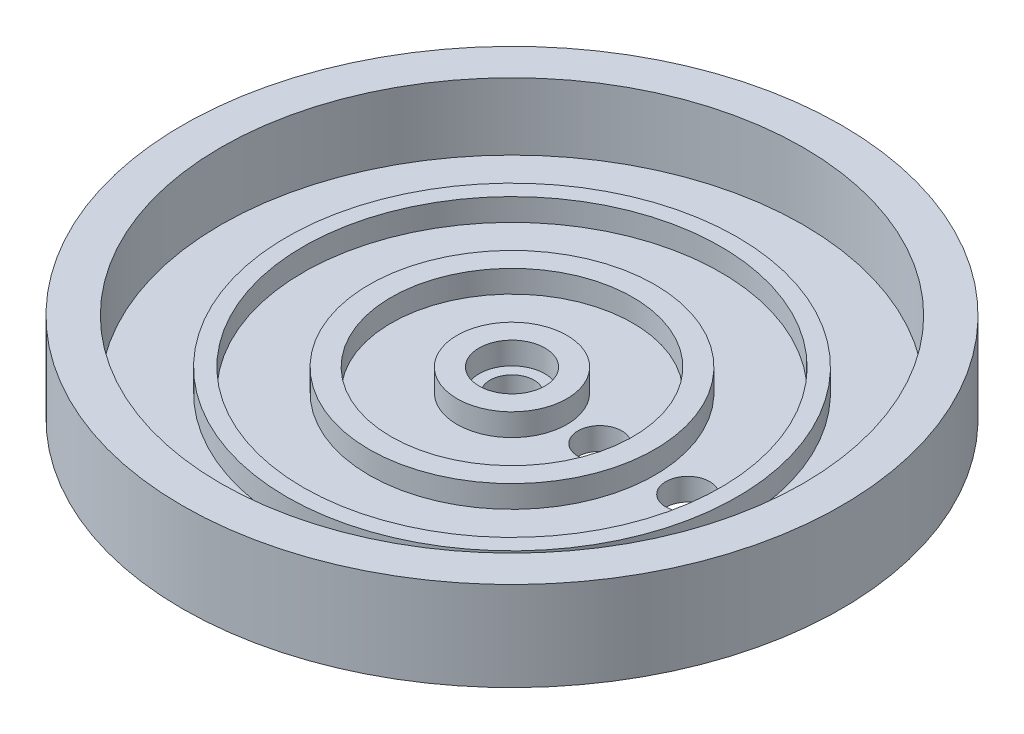
ISO-10303-21;
HEADER;
FILE_DESCRIPTION(('STEP AP214'),'2;1');
FILE_NAME('part.step','',(''),(''),'','','');
FILE_SCHEMA(('AUTOMOTIVE_DESIGN { 1 0 10303 214 1 1 1 1 }'));
ENDSEC;
DATA;
#1=APPLICATION_CONTEXT('core data for automotive mechanical design processes');
#2=APPLICATION_PROTOCOL_DEFINITION('international standard','automotive_design',2000,#1);
#3=PRODUCT_CONTEXT('',#1,'mechanical');
#4=PRODUCT('Part','Part','',(#3));
#5=PRODUCT_RELATED_PRODUCT_CATEGORY('part','',(#4));
#6=PRODUCT_DEFINITION_FORMATION('','',#4);
#7=PRODUCT_DEFINITION_CONTEXT('part definition',#1,'design');
#8=PRODUCT_DEFINITION('design','',#6,#7);
#9=PRODUCT_DEFINITION_SHAPE('','',#8);
#10=(LENGTH_UNIT() NAMED_UNIT(*) SI_UNIT(.MILLI.,.METRE.));
#11=(NAMED_UNIT(*) PLANE_ANGLE_UNIT() SI_UNIT($,.RADIAN.));
#12=(NAMED_UNIT(*) SI_UNIT($,.STERADIAN.) SOLID_ANGLE_UNIT());
#13=UNCERTAINTY_MEASURE_WITH_UNIT(LENGTH_MEASURE(1.E-05),#10,'distance_accuracy_value','');
#14=(GEOMETRIC_REPRESENTATION_CONTEXT(3) GLOBAL_UNCERTAINTY_ASSIGNED_CONTEXT((#13)) GLOBAL_UNIT_ASSIGNED_CONTEXT((#10,
#11,#12)) REPRESENTATION_CONTEXT('',''));
#15=CARTESIAN_POINT('',(0.,0.,0.));
#16=DIRECTION('',(0.,0.,1.));
#17=DIRECTION('',(1.,0.,0.));
#18=AXIS2_PLACEMENT_3D('',#15,#16,#17);
#19=CARTESIAN_POINT('',(0.,1.016,0.));
#20=DIRECTION('',(0.,1.,0.));
#21=DIRECTION('',(0.,0.,1.));
#22=AXIS2_PLACEMENT_3D('',#19,#20,#21);
#23=PLANE('',#22);
#24=CARTESIAN_POINT('',(0.,1.016,0.));
#25=DIRECTION('',(0.,1.,0.));
#26=DIRECTION('',(0.,0.,1.));
#27=AXIS2_PLACEMENT_3D('',#24,#25,#26);
#28=CIRCLE('',#27,1.);
#29=CARTESIAN_POINT('',(0.,1.016,1.));
#30=VERTEX_POINT('',#29);
#31=EDGE_CURVE('E93',#30,#30,#28,.T.);
#32=ORIENTED_EDGE('',*,*,#31,.F.);
#33=EDGE_LOOP('',(#32));
#34=FACE_BOUND('',#33,.T.);
#35=CARTESIAN_POINT('',(0.,1.016,0.));
#36=DIRECTION('',(0.,1.,0.));
#37=DIRECTION('',(0.,0.,1.));
#38=AXIS2_PLACEMENT_3D('',#35,#36,#37);
#39=CIRCLE('',#38,1.5);
#40=CARTESIAN_POINT('',(0.,1.016,1.5));
#41=VERTEX_POINT('',#40);
#42=EDGE_CURVE('E11',#41,#41,#39,.F.);
#43=ORIENTED_EDGE('',*,*,#42,.F.);
#44=EDGE_LOOP('',(#43));
#45=FACE_BOUND('',#44,.T.);
#46=ADVANCED_FACE('F70',(#34,#45),#23,.T.);
#47=CARTESIAN_POINT('',(0.,1.016,0.));
#48=DIRECTION('',(0.,1.,0.));
#49=DIRECTION('',(0.,0.,1.));
#50=AXIS2_PLACEMENT_3D('',#47,#48,#49);
#51=CIRCLE('',#50,2.5);
#52=CARTESIAN_POINT('',(0.,1.016,2.5));
#53=VERTEX_POINT('',#52);
#54=EDGE_CURVE('E130',#53,#53,#51,.T.);
#55=ORIENTED_EDGE('',*,*,#54,.F.);
#56=EDGE_LOOP('',(#55));
#57=FACE_BOUND('',#56,.T.);
#58=CARTESIAN_POINT('',(4.,1.016,0.));
#59=DIRECTION('',(0.,1.,0.));
#60=DIRECTION('',(0.,0.,1.));
#61=AXIS2_PLACEMENT_3D('',#58,#59,#60);
#62=CIRCLE('',#61,1.);
#63=CARTESIAN_POINT('',(4.,1.016,1.));
#64=VERTEX_POINT('',#63);
#65=EDGE_CURVE('E97',#64,#64,#62,.T.);
#66=ORIENTED_EDGE('',*,*,#65,.F.);
#67=EDGE_LOOP('',(#66));
#68=FACE_BOUND('',#67,.T.);
#69=CARTESIAN_POINT('',(0.,1.016,0.));
#70=DIRECTION('',(0.,1.,0.));
#71=DIRECTION('',(0.,0.,1.));
#72=AXIS2_PLACEMENT_3D('',#69,#70,#71);
#73=CIRCLE('',#72,5.5);
#74=CARTESIAN_POINT('',(0.,1.016,5.5));
#75=VERTEX_POINT('',#74);
#76=EDGE_CURVE('E77',#75,#75,#73,.F.);
#77=ORIENTED_EDGE('',*,*,#76,.F.);
#78=EDGE_LOOP('',(#77));
#79=FACE_BOUND('',#78,.T.);
#80=ADVANCED_FACE('F159',(#57,#68,#79),#23,.T.);
#81=CARTESIAN_POINT('',(0.,1.016,0.));
#82=DIRECTION('',(0.,1.,0.));
#83=DIRECTION('',(0.,0.,1.));
#84=AXIS2_PLACEMENT_3D('',#81,#82,#83);
#85=CIRCLE('',#84,6.5);
#86=CARTESIAN_POINT('',(0.,1.016,6.5));
#87=VERTEX_POINT('',#86);
#88=EDGE_CURVE('E121',#87,#87,#85,.T.);
#89=ORIENTED_EDGE('',*,*,#88,.F.);
#90=EDGE_LOOP('',(#89));
#91=FACE_BOUND('',#90,.T.);
#92=CARTESIAN_POINT('',(8.,1.016,0.));
#93=DIRECTION('',(0.,1.,0.));
#94=DIRECTION('',(0.,0.,1.));
#95=AXIS2_PLACEMENT_3D('',#92,#93,#94);
#96=CIRCLE('',#95,1.);
#97=CARTESIAN_POINT('',(8.,1.016,1.));
#98=VERTEX_POINT('',#97);
#99=EDGE_CURVE('E103',#98,#98,#96,.T.);
#100=ORIENTED_EDGE('',*,*,#99,.F.);
#101=EDGE_LOOP('',(#100));
#102=FACE_BOUND('',#101,.T.);
#103=CARTESIAN_POINT('',(0.,1.016,0.));
#104=DIRECTION('',(0.,1.,0.));
#105=DIRECTION('',(0.,0.,1.));
#106=AXIS2_PLACEMENT_3D('',#103,#104,#105);
#107=CIRCLE('',#106,9.5);
#108=CARTESIAN_POINT('',(0.,1.016,9.5));
#109=VERTEX_POINT('',#108);
#110=EDGE_CURVE('E81',#109,#109,#107,.F.);
#111=ORIENTED_EDGE('',*,*,#110,.F.);
#112=EDGE_LOOP('',(#111));
#113=FACE_BOUND('',#112,.T.);
#114=ADVANCED_FACE('F166',(#91,#102,#113),#23,.T.);
#115=CARTESIAN_POINT('',(0.,1.016,0.));
#116=DIRECTION('',(0.,1.,0.));
#117=DIRECTION('',(0.,0.,1.));
#118=AXIS2_PLACEMENT_3D('',#115,#116,#117);
#119=CIRCLE('',#118,10.25);
#120=CARTESIAN_POINT('',(0.,1.016,10.25));
#121=VERTEX_POINT('',#120);
#122=EDGE_CURVE('E112',#121,#121,#119,.T.);
#123=ORIENTED_EDGE('',*,*,#122,.F.);
#124=EDGE_LOOP('',(#123));
#125=FACE_BOUND('',#124,.T.);
#126=CARTESIAN_POINT('',(0.,1.016,0.));
#127=DIRECTION('',(0.,1.,0.));
#128=DIRECTION('',(0.,0.,1.));
#129=AXIS2_PLACEMENT_3D('',#126,#127,#128);
#130=CIRCLE('',#129,13.25);
#131=CARTESIAN_POINT('',(0.,1.016,13.25));
#132=VERTEX_POINT('',#131);
#133=EDGE_CURVE('E85',#132,#132,#130,.F.);
#134=ORIENTED_EDGE('',*,*,#133,.F.);
#135=EDGE_LOOP('',(#134));
#136=FACE_BOUND('',#135,.T.);
#137=ADVANCED_FACE('F162',(#125,#136),#23,.T.);
#138=CARTESIAN_POINT('',(0.,0.,0.));
#139=DIRECTION('',(0.,1.,0.));
#140=DIRECTION('',(0.,0.,1.));
#141=AXIS2_PLACEMENT_3D('',#138,#139,#140);
#142=PLANE('',#141);
#143=CARTESIAN_POINT('',(0.,0.,0.));
#144=DIRECTION('',(0.,1.,0.));
#145=DIRECTION('',(0.,0.,1.));
#146=AXIS2_PLACEMENT_3D('',#143,#144,#145);
#147=CIRCLE('',#146,15.);
#148=CARTESIAN_POINT('',(0.,0.,15.));
#149=VERTEX_POINT('',#148);
#150=EDGE_CURVE('E90',#149,#149,#147,.T.);
#151=ORIENTED_EDGE('',*,*,#150,.F.);
#152=EDGE_LOOP('',(#151));
#153=FACE_BOUND('',#152,.T.);
#154=CARTESIAN_POINT('',(0.,0.,0.));
#155=DIRECTION('',(0.,1.,0.));
#156=DIRECTION('',(0.,0.,1.));
#157=AXIS2_PLACEMENT_3D('',#154,#155,#156);
#158=CIRCLE('',#157,1.);
#159=CARTESIAN_POINT('',(0.,0.,1.));
#160=VERTEX_POINT('',#159);
#161=EDGE_CURVE('E94',#160,#160,#158,.T.);
#162=ORIENTED_EDGE('',*,*,#161,.T.);
#163=EDGE_LOOP('',(#162));
#164=FACE_BOUND('',#163,.T.);
#165=CARTESIAN_POINT('',(4.,0.,0.));
#166=DIRECTION('',(0.,1.,0.));
#167=DIRECTION('',(0.,0.,1.));
#168=AXIS2_PLACEMENT_3D('',#165,#166,#167);
#169=CIRCLE('',#168,1.);
#170=CARTESIAN_POINT('',(4.,0.,1.));
#171=VERTEX_POINT('',#170);
#172=EDGE_CURVE('E100',#171,#171,#169,.T.);
#173=ORIENTED_EDGE('',*,*,#172,.T.);
#174=EDGE_LOOP('',(#173));
#175=FACE_BOUND('',#174,.T.);
#176=CARTESIAN_POINT('',(8.,0.,0.));
#177=DIRECTION('',(0.,1.,0.));
#178=DIRECTION('',(0.,0.,1.));
#179=AXIS2_PLACEMENT_3D('',#176,#177,#178);
#180=CIRCLE('',#179,1.);
#181=CARTESIAN_POINT('',(8.,0.,1.));
#182=VERTEX_POINT('',#181);
#183=EDGE_CURVE('E106',#182,#182,#180,.T.);
#184=ORIENTED_EDGE('',*,*,#183,.T.);
#185=EDGE_LOOP('',(#184));
#186=FACE_BOUND('',#185,.T.);
#187=ADVANCED_FACE('F172',(#153,#164,#175,#186),#142,.F.);
#188=CARTESIAN_POINT('',(0.,1.016,0.));
#189=DIRECTION('',(0.,-1.,0.));
#190=DIRECTION('',(0.,0.,-1.));
#191=AXIS2_PLACEMENT_3D('',#188,#189,#190);
#192=CYLINDRICAL_SURFACE('',#191,15.);
#193=ORIENTED_EDGE('',*,*,#150,.T.);
#194=EDGE_LOOP('',(#193));
#195=FACE_BOUND('',#194,.T.);
#196=CARTESIAN_POINT('',(0.,4.064,0.));
#197=DIRECTION('',(0.,1.,0.));
#198=DIRECTION('',(0.,0.,1.));
#199=AXIS2_PLACEMENT_3D('',#196,#197,#198);
#200=CIRCLE('',#199,15.);
#201=CARTESIAN_POINT('',(0.,4.064,15.));
#202=VERTEX_POINT('',#201);
#203=EDGE_CURVE('E134',#202,#202,#200,.T.);
#204=ORIENTED_EDGE('',*,*,#203,.F.);
#205=EDGE_LOOP('',(#204));
#206=FACE_BOUND('',#205,.T.);
#207=ADVANCED_FACE('F72',(#195,#206),#192,.T.);
#208=CARTESIAN_POINT('',(0.,1.016,0.));
#209=DIRECTION('',(0.,-1.,0.));
#210=DIRECTION('',(0.,0.,-1.));
#211=AXIS2_PLACEMENT_3D('',#208,#209,#210);
#212=CYLINDRICAL_SURFACE('',#211,1.);
#213=ORIENTED_EDGE('',*,*,#31,.T.);
#214=EDGE_LOOP('',(#213));
#215=FACE_BOUND('',#214,.T.);
#216=ORIENTED_EDGE('',*,*,#161,.F.);
#217=EDGE_LOOP('',(#216));
#218=FACE_BOUND('',#217,.T.);
#219=ADVANCED_FACE('F201',(#215,#218),#212,.F.);
#220=CARTESIAN_POINT('',(4.,1.016,0.));
#221=DIRECTION('',(0.,-1.,0.));
#222=DIRECTION('',(0.,0.,-1.));
#223=AXIS2_PLACEMENT_3D('',#220,#221,#222);
#224=CYLINDRICAL_SURFACE('',#223,1.);
#225=ORIENTED_EDGE('',*,*,#65,.T.);
#226=EDGE_LOOP('',(#225));
#227=FACE_BOUND('',#226,.T.);
#228=ORIENTED_EDGE('',*,*,#172,.F.);
#229=EDGE_LOOP('',(#228));
#230=FACE_BOUND('',#229,.T.);
#231=ADVANCED_FACE('F195',(#227,#230),#224,.F.);
#232=CARTESIAN_POINT('',(8.,1.016,0.));
#233=DIRECTION('',(0.,-1.,0.));
#234=DIRECTION('',(0.,0.,-1.));
#235=AXIS2_PLACEMENT_3D('',#232,#233,#234);
#236=CYLINDRICAL_SURFACE('',#235,1.);
#237=ORIENTED_EDGE('',*,*,#99,.T.);
#238=EDGE_LOOP('',(#237));
#239=FACE_BOUND('',#238,.T.);
#240=ORIENTED_EDGE('',*,*,#183,.F.);
#241=EDGE_LOOP('',(#240));
#242=FACE_BOUND('',#241,.T.);
#243=ADVANCED_FACE('F186',(#239,#242),#236,.F.);
#244=CARTESIAN_POINT('',(0.,2.032,0.));
#245=DIRECTION('',(0.,-1.,0.));
#246=DIRECTION('',(0.,0.,-1.));
#247=AXIS2_PLACEMENT_3D('',#244,#245,#246);
#248=CYLINDRICAL_SURFACE('',#247,13.25);
#249=ORIENTED_EDGE('',*,*,#133,.T.);
#250=EDGE_LOOP('',(#249));
#251=FACE_BOUND('',#250,.T.);
#252=CARTESIAN_POINT('',(0.,4.064,0.));
#253=DIRECTION('',(0.,1.,0.));
#254=DIRECTION('',(0.,0.,1.));
#255=AXIS2_PLACEMENT_3D('',#252,#253,#254);
#256=CIRCLE('',#255,13.25);
#257=CARTESIAN_POINT('',(0.,4.064,13.25));
#258=VERTEX_POINT('',#257);
#259=EDGE_CURVE('E141',#258,#258,#256,.T.);
#260=ORIENTED_EDGE('',*,*,#259,.T.);
#261=EDGE_LOOP('',(#260));
#262=FACE_BOUND('',#261,.T.);
#263=ADVANCED_FACE('F145',(#251,#262),#248,.F.);
#264=CARTESIAN_POINT('',(0.,2.032,0.));
#265=DIRECTION('',(0.,-1.,0.));
#266=DIRECTION('',(0.,0.,-1.));
#267=AXIS2_PLACEMENT_3D('',#264,#265,#266);
#268=CYLINDRICAL_SURFACE('',#267,9.5);
#269=CARTESIAN_POINT('',(0.,2.032,0.));
#270=DIRECTION('',(0.,1.,0.));
#271=DIRECTION('',(0.,0.,1.));
#272=AXIS2_PLACEMENT_3D('',#269,#270,#271);
#273=CIRCLE('',#272,9.5);
#274=CARTESIAN_POINT('',(0.,2.032,9.5));
#275=VERTEX_POINT('',#274);
#276=EDGE_CURVE('E115',#275,#275,#273,.T.);
#277=ORIENTED_EDGE('',*,*,#276,.T.);
#278=EDGE_LOOP('',(#277));
#279=FACE_BOUND('',#278,.T.);
#280=ORIENTED_EDGE('',*,*,#110,.T.);
#281=EDGE_LOOP('',(#280));
#282=FACE_BOUND('',#281,.T.);
#283=ADVANCED_FACE('F185',(#279,#282),#268,.F.);
#284=CARTESIAN_POINT('',(0.,2.032,0.));
#285=DIRECTION('',(0.,-1.,0.));
#286=DIRECTION('',(0.,0.,-1.));
#287=AXIS2_PLACEMENT_3D('',#284,#285,#286);
#288=CYLINDRICAL_SURFACE('',#287,10.25);
#289=CARTESIAN_POINT('',(0.,2.032,0.));
#290=DIRECTION('',(0.,1.,0.));
#291=DIRECTION('',(0.,0.,1.));
#292=AXIS2_PLACEMENT_3D('',#289,#290,#291);
#293=CIRCLE('',#292,10.25);
#294=CARTESIAN_POINT('',(0.,2.032,10.25));
#295=VERTEX_POINT('',#294);
#296=EDGE_CURVE('E109',#295,#295,#293,.T.);
#297=ORIENTED_EDGE('',*,*,#296,.F.);
#298=EDGE_LOOP('',(#297));
#299=FACE_BOUND('',#298,.T.);
#300=ORIENTED_EDGE('',*,*,#122,.T.);
#301=EDGE_LOOP('',(#300));
#302=FACE_BOUND('',#301,.T.);
#303=ADVANCED_FACE('F192',(#299,#302),#288,.T.);
#304=CARTESIAN_POINT('',(0.,2.032,0.));
#305=DIRECTION('',(0.,1.,0.));
#306=DIRECTION('',(0.,0.,1.));
#307=AXIS2_PLACEMENT_3D('',#304,#305,#306);
#308=PLANE('',#307);
#309=ORIENTED_EDGE('',*,*,#276,.F.);
#310=EDGE_LOOP('',(#309));
#311=FACE_BOUND('',#310,.T.);
#312=ORIENTED_EDGE('',*,*,#296,.T.);
#313=EDGE_LOOP('',(#312));
#314=FACE_BOUND('',#313,.T.);
#315=ADVANCED_FACE('F282',(#311,#314),#308,.T.);
#316=CARTESIAN_POINT('',(0.,2.032,0.));
#317=DIRECTION('',(0.,-1.,0.));
#318=DIRECTION('',(0.,0.,-1.));
#319=AXIS2_PLACEMENT_3D('',#316,#317,#318);
#320=CYLINDRICAL_SURFACE('',#319,5.5);
#321=CARTESIAN_POINT('',(0.,2.032,0.));
#322=DIRECTION('',(0.,1.,0.));
#323=DIRECTION('',(0.,0.,1.));
#324=AXIS2_PLACEMENT_3D('',#321,#322,#323);
#325=CIRCLE('',#324,5.5);
#326=CARTESIAN_POINT('',(0.,2.032,5.5));
#327=VERTEX_POINT('',#326);
#328=EDGE_CURVE('E124',#327,#327,#325,.T.);
#329=ORIENTED_EDGE('',*,*,#328,.T.);
#330=EDGE_LOOP('',(#329));
#331=FACE_BOUND('',#330,.T.);
#332=ORIENTED_EDGE('',*,*,#76,.T.);
#333=EDGE_LOOP('',(#332));
#334=FACE_BOUND('',#333,.T.);
#335=ADVANCED_FACE('F291',(#331,#334),#320,.F.);
#336=CARTESIAN_POINT('',(0.,2.032,0.));
#337=DIRECTION('',(0.,-1.,0.));
#338=DIRECTION('',(0.,0.,-1.));
#339=AXIS2_PLACEMENT_3D('',#336,#337,#338);
#340=CYLINDRICAL_SURFACE('',#339,6.5);
#341=CARTESIAN_POINT('',(0.,2.032,0.));
#342=DIRECTION('',(0.,1.,0.));
#343=DIRECTION('',(0.,0.,1.));
#344=AXIS2_PLACEMENT_3D('',#341,#342,#343);
#345=CIRCLE('',#344,6.5);
#346=CARTESIAN_POINT('',(0.,2.032,6.5));
#347=VERTEX_POINT('',#346);
#348=EDGE_CURVE('E116',#347,#347,#345,.T.);
#349=ORIENTED_EDGE('',*,*,#348,.F.);
#350=EDGE_LOOP('',(#349));
#351=FACE_BOUND('',#350,.T.);
#352=ORIENTED_EDGE('',*,*,#88,.T.);
#353=EDGE_LOOP('',(#352));
#354=FACE_BOUND('',#353,.T.);
#355=ADVANCED_FACE('F301',(#351,#354),#340,.T.);
#356=CARTESIAN_POINT('',(0.,2.032,0.));
#357=DIRECTION('',(0.,1.,0.));
#358=DIRECTION('',(0.,0.,1.));
#359=AXIS2_PLACEMENT_3D('',#356,#357,#358);
#360=PLANE('',#359);
#361=ORIENTED_EDGE('',*,*,#328,.F.);
#362=EDGE_LOOP('',(#361));
#363=FACE_BOUND('',#362,.T.);
#364=ORIENTED_EDGE('',*,*,#348,.T.);
#365=EDGE_LOOP('',(#364));
#366=FACE_BOUND('',#365,.T.);
#367=ADVANCED_FACE('F311',(#363,#366),#360,.T.);
#368=CARTESIAN_POINT('',(0.,2.032,0.));
#369=DIRECTION('',(0.,-1.,0.));
#370=DIRECTION('',(0.,0.,-1.));
#371=AXIS2_PLACEMENT_3D('',#368,#369,#370);
#372=CYLINDRICAL_SURFACE('',#371,1.5);
#373=CARTESIAN_POINT('',(0.,2.032,0.));
#374=DIRECTION('',(0.,1.,0.));
#375=DIRECTION('',(0.,0.,1.));
#376=AXIS2_PLACEMENT_3D('',#373,#374,#375);
#377=CIRCLE('',#376,1.5);
#378=CARTESIAN_POINT('',(0.,2.032,1.5));
#379=VERTEX_POINT('',#378);
#380=EDGE_CURVE('E133',#379,#379,#377,.T.);
#381=ORIENTED_EDGE('',*,*,#380,.T.);
#382=EDGE_LOOP('',(#381));
#383=FACE_BOUND('',#382,.T.);
#384=ORIENTED_EDGE('',*,*,#42,.T.);
#385=EDGE_LOOP('',(#384));
#386=FACE_BOUND('',#385,.T.);
#387=ADVANCED_FACE('F321',(#383,#386),#372,.F.);
#388=CARTESIAN_POINT('',(0.,2.032,0.));
#389=DIRECTION('',(0.,-1.,0.));
#390=DIRECTION('',(0.,0.,-1.));
#391=AXIS2_PLACEMENT_3D('',#388,#389,#390);
#392=CYLINDRICAL_SURFACE('',#391,2.5);
#393=CARTESIAN_POINT('',(0.,2.032,0.));
#394=DIRECTION('',(0.,1.,0.));
#395=DIRECTION('',(0.,0.,1.));
#396=AXIS2_PLACEMENT_3D('',#393,#394,#395);
#397=CIRCLE('',#396,2.5);
#398=CARTESIAN_POINT('',(0.,2.032,2.5));
#399=VERTEX_POINT('',#398);
#400=EDGE_CURVE('E125',#399,#399,#397,.T.);
#401=ORIENTED_EDGE('',*,*,#400,.F.);
#402=EDGE_LOOP('',(#401));
#403=FACE_BOUND('',#402,.T.);
#404=ORIENTED_EDGE('',*,*,#54,.T.);
#405=EDGE_LOOP('',(#404));
#406=FACE_BOUND('',#405,.T.);
#407=ADVANCED_FACE('F155',(#403,#406),#392,.T.);
#408=CARTESIAN_POINT('',(0.,2.032,0.));
#409=DIRECTION('',(0.,1.,0.));
#410=DIRECTION('',(0.,0.,1.));
#411=AXIS2_PLACEMENT_3D('',#408,#409,#410);
#412=PLANE('',#411);
#413=ORIENTED_EDGE('',*,*,#380,.F.);
#414=EDGE_LOOP('',(#413));
#415=FACE_BOUND('',#414,.T.);
#416=ORIENTED_EDGE('',*,*,#400,.T.);
#417=EDGE_LOOP('',(#416));
#418=FACE_BOUND('',#417,.T.);
#419=ADVANCED_FACE('F149',(#415,#418),#412,.T.);
#420=CARTESIAN_POINT('',(0.,4.064,0.));
#421=DIRECTION('',(0.,1.,0.));
#422=DIRECTION('',(0.,0.,1.));
#423=AXIS2_PLACEMENT_3D('',#420,#421,#422);
#424=PLANE('',#423);
#425=ORIENTED_EDGE('',*,*,#203,.T.);
#426=EDGE_LOOP('',(#425));
#427=FACE_BOUND('',#426,.T.);
#428=ORIENTED_EDGE('',*,*,#259,.F.);
#429=EDGE_LOOP('',(#428));
#430=FACE_BOUND('',#429,.T.);
#431=ADVANCED_FACE('F147',(#427,#430),#424,.T.);
#432=CLOSED_SHELL('',(#46,#80,#114,#137,#187,#207,#219,#231,#243,#263,#283,#303,#315,#335,#355,
#367,#387,#407,#419,#431));
#433=MANIFOLD_SOLID_BREP('B2',#432);
#434=ADVANCED_BREP_SHAPE_REPRESENTATION('',(#18,#433),#14);
#435=SHAPE_DEFINITION_REPRESENTATION(#9,#434);
ENDSEC;
END-ISO-10303-21;
